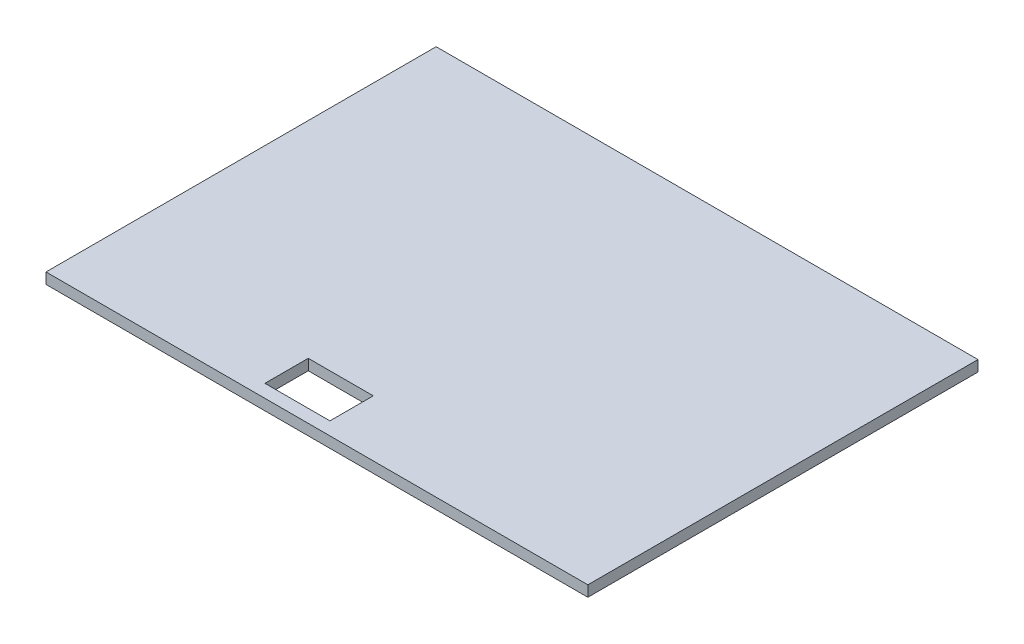
ISO-10303-21;
HEADER;
FILE_DESCRIPTION(('STEP AP214'),'2;1');
FILE_NAME('part.step','',(''),(''),'','','');
FILE_SCHEMA(('AUTOMOTIVE_DESIGN { 1 0 10303 214 1 1 1 1 }'));
ENDSEC;
DATA;
#1=APPLICATION_CONTEXT('core data for automotive mechanical design processes');
#2=APPLICATION_PROTOCOL_DEFINITION('international standard','automotive_design',2000,#1);
#3=PRODUCT_CONTEXT('',#1,'mechanical');
#4=PRODUCT('Part','Part','',(#3));
#5=PRODUCT_RELATED_PRODUCT_CATEGORY('part','',(#4));
#6=PRODUCT_DEFINITION_FORMATION('','',#4);
#7=PRODUCT_DEFINITION_CONTEXT('part definition',#1,'design');
#8=PRODUCT_DEFINITION('design','',#6,#7);
#9=PRODUCT_DEFINITION_SHAPE('','',#8);
#10=(LENGTH_UNIT() NAMED_UNIT(*) SI_UNIT(.MILLI.,.METRE.));
#11=(NAMED_UNIT(*) PLANE_ANGLE_UNIT() SI_UNIT($,.RADIAN.));
#12=(NAMED_UNIT(*) SI_UNIT($,.STERADIAN.) SOLID_ANGLE_UNIT());
#13=UNCERTAINTY_MEASURE_WITH_UNIT(LENGTH_MEASURE(1.E-05),#10,'distance_accuracy_value','');
#14=(GEOMETRIC_REPRESENTATION_CONTEXT(3) GLOBAL_UNCERTAINTY_ASSIGNED_CONTEXT((#13)) GLOBAL_UNIT_ASSIGNED_CONTEXT((#10,
#11,#12)) REPRESENTATION_CONTEXT('',''));
#15=CARTESIAN_POINT('',(0.,0.,0.));
#16=DIRECTION('',(0.,0.,1.));
#17=DIRECTION('',(1.,0.,0.));
#18=AXIS2_PLACEMENT_3D('',#15,#16,#17);
#19=CARTESIAN_POINT('',(0.,2.5,0.));
#20=DIRECTION('',(0.,1.,0.));
#21=DIRECTION('',(0.,0.,1.));
#22=AXIS2_PLACEMENT_3D('',#19,#20,#21);
#23=PLANE('',#22);
#24=DIRECTION('',(0.,0.,1.));
#25=VECTOR('',#24,1.);
#26=CARTESIAN_POINT('',(-62.5,2.5,45.));
#27=LINE('',#26,#25);
#28=CARTESIAN_POINT('',(-62.5,2.5,-45.));
#29=VERTEX_POINT('',#28);
#30=CARTESIAN_POINT('',(-62.5,2.5,45.));
#31=VERTEX_POINT('',#30);
#32=EDGE_CURVE('E138',#29,#31,#27,.T.);
#33=ORIENTED_EDGE('',*,*,#32,.T.);
#34=DIRECTION('',(1.,0.,0.));
#35=VECTOR('',#34,1.);
#36=CARTESIAN_POINT('',(62.5,2.5,45.));
#37=LINE('',#36,#35);
#38=CARTESIAN_POINT('',(62.5,2.5,45.));
#39=VERTEX_POINT('',#38);
#40=EDGE_CURVE('E141',#31,#39,#37,.T.);
#41=ORIENTED_EDGE('',*,*,#40,.T.);
#42=DIRECTION('',(0.,0.,-1.));
#43=VECTOR('',#42,1.);
#44=CARTESIAN_POINT('',(62.5,2.5,45.));
#45=LINE('',#44,#43);
#46=CARTESIAN_POINT('',(62.5,2.5,-45.));
#47=VERTEX_POINT('',#46);
#48=EDGE_CURVE('E144',#39,#47,#45,.T.);
#49=ORIENTED_EDGE('',*,*,#48,.T.);
#50=DIRECTION('',(-1.,0.,0.));
#51=VECTOR('',#50,1.);
#52=CARTESIAN_POINT('',(62.5,2.5,-45.));
#53=LINE('',#52,#51);
#54=EDGE_CURVE('E146',#47,#29,#53,.T.);
#55=ORIENTED_EDGE('',*,*,#54,.T.);
#56=EDGE_LOOP('',(#33,#41,#49,#55));
#57=FACE_BOUND('',#56,.T.);
#58=DIRECTION('',(-1.,0.,0.));
#59=VECTOR('',#58,1.);
#60=CARTESIAN_POINT('',(-15.,2.5,32.));
#61=LINE('',#60,#59);
#62=CARTESIAN_POINT('',(0.,2.5,32.));
#63=VERTEX_POINT('',#62);
#64=CARTESIAN_POINT('',(-15.,2.5,32.));
#65=VERTEX_POINT('',#64);
#66=EDGE_CURVE('E110',#63,#65,#61,.T.);
#67=ORIENTED_EDGE('',*,*,#66,.F.);
#68=DIRECTION('',(0.,0.,-1.));
#69=VECTOR('',#68,1.);
#70=CARTESIAN_POINT('',(0.,2.5,32.));
#71=LINE('',#70,#69);
#72=CARTESIAN_POINT('',(0.,2.5,42.));
#73=VERTEX_POINT('',#72);
#74=EDGE_CURVE('E102',#73,#63,#71,.T.);
#75=ORIENTED_EDGE('',*,*,#74,.F.);
#76=DIRECTION('',(1.,0.,0.));
#77=VECTOR('',#76,1.);
#78=CARTESIAN_POINT('',(-15.,2.5,42.));
#79=LINE('',#78,#77);
#80=CARTESIAN_POINT('',(-15.,2.5,42.));
#81=VERTEX_POINT('',#80);
#82=EDGE_CURVE('E124',#81,#73,#79,.T.);
#83=ORIENTED_EDGE('',*,*,#82,.F.);
#84=DIRECTION('',(0.,0.,1.));
#85=VECTOR('',#84,1.);
#86=CARTESIAN_POINT('',(-15.,2.5,32.));
#87=LINE('',#86,#85);
#88=EDGE_CURVE('E122',#65,#81,#87,.T.);
#89=ORIENTED_EDGE('',*,*,#88,.F.);
#90=EDGE_LOOP('',(#67,#75,#83,#89));
#91=FACE_BOUND('',#90,.T.);
#92=ADVANCED_FACE('F37',(#57,#91),#23,.T.);
#93=CARTESIAN_POINT('',(0.,0.,0.));
#94=DIRECTION('',(0.,1.,0.));
#95=DIRECTION('',(0.,0.,1.));
#96=AXIS2_PLACEMENT_3D('',#93,#94,#95);
#97=PLANE('',#96);
#98=DIRECTION('',(0.,0.,1.));
#99=VECTOR('',#98,1.);
#100=CARTESIAN_POINT('',(-62.5,0.,45.));
#101=LINE('',#100,#99);
#102=CARTESIAN_POINT('',(-62.5,0.,-45.));
#103=VERTEX_POINT('',#102);
#104=CARTESIAN_POINT('',(-62.5,0.,45.));
#105=VERTEX_POINT('',#104);
#106=EDGE_CURVE('E118',#103,#105,#101,.T.);
#107=ORIENTED_EDGE('',*,*,#106,.F.);
#108=DIRECTION('',(-1.,0.,0.));
#109=VECTOR('',#108,1.);
#110=CARTESIAN_POINT('',(62.5,0.,-45.));
#111=LINE('',#110,#109);
#112=CARTESIAN_POINT('',(62.5,0.,-45.));
#113=VERTEX_POINT('',#112);
#114=EDGE_CURVE('E142',#113,#103,#111,.T.);
#115=ORIENTED_EDGE('',*,*,#114,.F.);
#116=DIRECTION('',(0.,0.,-1.));
#117=VECTOR('',#116,1.);
#118=CARTESIAN_POINT('',(62.5,0.,45.));
#119=LINE('',#118,#117);
#120=CARTESIAN_POINT('',(62.5,0.,45.));
#121=VERTEX_POINT('',#120);
#122=EDGE_CURVE('E153',#121,#113,#119,.T.);
#123=ORIENTED_EDGE('',*,*,#122,.F.);
#124=DIRECTION('',(1.,0.,0.));
#125=VECTOR('',#124,1.);
#126=CARTESIAN_POINT('',(62.5,0.,45.));
#127=LINE('',#126,#125);
#128=EDGE_CURVE('E151',#105,#121,#127,.T.);
#129=ORIENTED_EDGE('',*,*,#128,.F.);
#130=EDGE_LOOP('',(#107,#115,#123,#129));
#131=FACE_BOUND('',#130,.T.);
#132=DIRECTION('',(0.,0.,-1.));
#133=VECTOR('',#132,1.);
#134=CARTESIAN_POINT('',(0.,0.,32.));
#135=LINE('',#134,#133);
#136=CARTESIAN_POINT('',(0.,0.,42.));
#137=VERTEX_POINT('',#136);
#138=CARTESIAN_POINT('',(0.,0.,32.));
#139=VERTEX_POINT('',#138);
#140=EDGE_CURVE('E60',#137,#139,#135,.T.);
#141=ORIENTED_EDGE('',*,*,#140,.T.);
#142=DIRECTION('',(-1.,0.,0.));
#143=VECTOR('',#142,1.);
#144=CARTESIAN_POINT('',(-15.,0.,32.));
#145=LINE('',#144,#143);
#146=CARTESIAN_POINT('',(-15.,0.,32.));
#147=VERTEX_POINT('',#146);
#148=EDGE_CURVE('E117',#139,#147,#145,.T.);
#149=ORIENTED_EDGE('',*,*,#148,.T.);
#150=DIRECTION('',(0.,0.,1.));
#151=VECTOR('',#150,1.);
#152=CARTESIAN_POINT('',(-15.,0.,32.));
#153=LINE('',#152,#151);
#154=CARTESIAN_POINT('',(-15.,0.,42.));
#155=VERTEX_POINT('',#154);
#156=EDGE_CURVE('E130',#147,#155,#153,.T.);
#157=ORIENTED_EDGE('',*,*,#156,.T.);
#158=DIRECTION('',(1.,0.,0.));
#159=VECTOR('',#158,1.);
#160=CARTESIAN_POINT('',(-15.,0.,42.));
#161=LINE('',#160,#159);
#162=EDGE_CURVE('E111',#155,#137,#161,.T.);
#163=ORIENTED_EDGE('',*,*,#162,.T.);
#164=EDGE_LOOP('',(#141,#149,#157,#163));
#165=FACE_BOUND('',#164,.T.);
#166=ADVANCED_FACE('F171',(#131,#165),#97,.F.);
#167=CARTESIAN_POINT('',(-62.5,2.5,45.));
#168=DIRECTION('',(1.,0.,0.));
#169=DIRECTION('',(0.,0.,-1.));
#170=AXIS2_PLACEMENT_3D('',#167,#168,#169);
#171=PLANE('',#170);
#172=ORIENTED_EDGE('',*,*,#106,.T.);
#173=DIRECTION('',(0.,-1.,0.));
#174=VECTOR('',#173,1.);
#175=CARTESIAN_POINT('',(-62.5,2.5,45.));
#176=LINE('',#175,#174);
#177=EDGE_CURVE('E11',#31,#105,#176,.T.);
#178=ORIENTED_EDGE('',*,*,#177,.F.);
#179=ORIENTED_EDGE('',*,*,#32,.F.);
#180=DIRECTION('',(0.,-1.,0.));
#181=VECTOR('',#180,1.);
#182=CARTESIAN_POINT('',(-62.5,2.5,-45.));
#183=LINE('',#182,#181);
#184=EDGE_CURVE('E148',#29,#103,#183,.T.);
#185=ORIENTED_EDGE('',*,*,#184,.T.);
#186=EDGE_LOOP('',(#172,#178,#179,#185));
#187=FACE_BOUND('',#186,.T.);
#188=ADVANCED_FACE('F39',(#187),#171,.F.);
#189=CARTESIAN_POINT('',(62.5,2.5,45.));
#190=DIRECTION('',(0.,0.,-1.));
#191=DIRECTION('',(-1.,0.,0.));
#192=AXIS2_PLACEMENT_3D('',#189,#190,#191);
#193=PLANE('',#192);
#194=ORIENTED_EDGE('',*,*,#128,.T.);
#195=DIRECTION('',(0.,-1.,0.));
#196=VECTOR('',#195,1.);
#197=CARTESIAN_POINT('',(62.5,2.5,45.));
#198=LINE('',#197,#196);
#199=EDGE_CURVE('E45',#39,#121,#198,.T.);
#200=ORIENTED_EDGE('',*,*,#199,.F.);
#201=ORIENTED_EDGE('',*,*,#40,.F.);
#202=ORIENTED_EDGE('',*,*,#177,.T.);
#203=EDGE_LOOP('',(#194,#200,#201,#202));
#204=FACE_BOUND('',#203,.T.);
#205=ADVANCED_FACE('F181',(#204),#193,.F.);
#206=CARTESIAN_POINT('',(62.5,2.5,45.));
#207=DIRECTION('',(-1.,0.,0.));
#208=DIRECTION('',(0.,0.,1.));
#209=AXIS2_PLACEMENT_3D('',#206,#207,#208);
#210=PLANE('',#209);
#211=ORIENTED_EDGE('',*,*,#122,.T.);
#212=DIRECTION('',(0.,-1.,0.));
#213=VECTOR('',#212,1.);
#214=CARTESIAN_POINT('',(62.5,2.5,-45.));
#215=LINE('',#214,#213);
#216=EDGE_CURVE('E158',#47,#113,#215,.T.);
#217=ORIENTED_EDGE('',*,*,#216,.F.);
#218=ORIENTED_EDGE('',*,*,#48,.F.);
#219=ORIENTED_EDGE('',*,*,#199,.T.);
#220=EDGE_LOOP('',(#211,#217,#218,#219));
#221=FACE_BOUND('',#220,.T.);
#222=ADVANCED_FACE('F165',(#221),#210,.F.);
#223=CARTESIAN_POINT('',(62.5,2.5,-45.));
#224=DIRECTION('',(0.,0.,1.));
#225=DIRECTION('',(1.,0.,0.));
#226=AXIS2_PLACEMENT_3D('',#223,#224,#225);
#227=PLANE('',#226);
#228=ORIENTED_EDGE('',*,*,#114,.T.);
#229=ORIENTED_EDGE('',*,*,#184,.F.);
#230=ORIENTED_EDGE('',*,*,#54,.F.);
#231=ORIENTED_EDGE('',*,*,#216,.T.);
#232=EDGE_LOOP('',(#228,#229,#230,#231));
#233=FACE_BOUND('',#232,.T.);
#234=ADVANCED_FACE('F175',(#233),#227,.F.);
#235=CARTESIAN_POINT('',(0.,2.5,32.));
#236=DIRECTION('',(-1.,0.,0.));
#237=DIRECTION('',(0.,0.,1.));
#238=AXIS2_PLACEMENT_3D('',#235,#236,#237);
#239=PLANE('',#238);
#240=ORIENTED_EDGE('',*,*,#140,.F.);
#241=DIRECTION('',(0.,-1.,0.));
#242=VECTOR('',#241,1.);
#243=CARTESIAN_POINT('',(0.,2.5,42.));
#244=LINE('',#243,#242);
#245=EDGE_CURVE('E106',#73,#137,#244,.T.);
#246=ORIENTED_EDGE('',*,*,#245,.F.);
#247=ORIENTED_EDGE('',*,*,#74,.T.);
#248=DIRECTION('',(0.,-1.,0.));
#249=VECTOR('',#248,1.);
#250=CARTESIAN_POINT('',(0.,2.5,32.));
#251=LINE('',#250,#249);
#252=EDGE_CURVE('E105',#63,#139,#251,.T.);
#253=ORIENTED_EDGE('',*,*,#252,.T.);
#254=EDGE_LOOP('',(#240,#246,#247,#253));
#255=FACE_BOUND('',#254,.T.);
#256=ADVANCED_FACE('F104',(#255),#239,.T.);
#257=CARTESIAN_POINT('',(-15.,2.5,32.));
#258=DIRECTION('',(0.,0.,1.));
#259=DIRECTION('',(1.,0.,0.));
#260=AXIS2_PLACEMENT_3D('',#257,#258,#259);
#261=PLANE('',#260);
#262=ORIENTED_EDGE('',*,*,#148,.F.);
#263=ORIENTED_EDGE('',*,*,#252,.F.);
#264=ORIENTED_EDGE('',*,*,#66,.T.);
#265=DIRECTION('',(0.,-1.,0.));
#266=VECTOR('',#265,1.);
#267=CARTESIAN_POINT('',(-15.,2.5,32.));
#268=LINE('',#267,#266);
#269=EDGE_CURVE('E119',#65,#147,#268,.T.);
#270=ORIENTED_EDGE('',*,*,#269,.T.);
#271=EDGE_LOOP('',(#262,#263,#264,#270));
#272=FACE_BOUND('',#271,.T.);
#273=ADVANCED_FACE('F114',(#272),#261,.T.);
#274=CARTESIAN_POINT('',(-15.,2.5,32.));
#275=DIRECTION('',(1.,0.,0.));
#276=DIRECTION('',(0.,0.,-1.));
#277=AXIS2_PLACEMENT_3D('',#274,#275,#276);
#278=PLANE('',#277);
#279=ORIENTED_EDGE('',*,*,#156,.F.);
#280=ORIENTED_EDGE('',*,*,#269,.F.);
#281=ORIENTED_EDGE('',*,*,#88,.T.);
#282=DIRECTION('',(0.,-1.,0.));
#283=VECTOR('',#282,1.);
#284=CARTESIAN_POINT('',(-15.,2.5,42.));
#285=LINE('',#284,#283);
#286=EDGE_CURVE('E52',#81,#155,#285,.T.);
#287=ORIENTED_EDGE('',*,*,#286,.T.);
#288=EDGE_LOOP('',(#279,#280,#281,#287));
#289=FACE_BOUND('',#288,.T.);
#290=ADVANCED_FACE('F204',(#289),#278,.T.);
#291=CARTESIAN_POINT('',(-15.,2.5,42.));
#292=DIRECTION('',(0.,0.,-1.));
#293=DIRECTION('',(-1.,0.,0.));
#294=AXIS2_PLACEMENT_3D('',#291,#292,#293);
#295=PLANE('',#294);
#296=ORIENTED_EDGE('',*,*,#162,.F.);
#297=ORIENTED_EDGE('',*,*,#286,.F.);
#298=ORIENTED_EDGE('',*,*,#82,.T.);
#299=ORIENTED_EDGE('',*,*,#245,.T.);
#300=EDGE_LOOP('',(#296,#297,#298,#299));
#301=FACE_BOUND('',#300,.T.);
#302=ADVANCED_FACE('F208',(#301),#295,.T.);
#303=CLOSED_SHELL('',(#92,#166,#188,#205,#222,#234,#256,#273,#290,#302));
#304=MANIFOLD_SOLID_BREP('B2',#303);
#305=ADVANCED_BREP_SHAPE_REPRESENTATION('',(#18,#304),#14);
#306=SHAPE_DEFINITION_REPRESENTATION(#9,#305);
ENDSEC;
END-ISO-10303-21;
